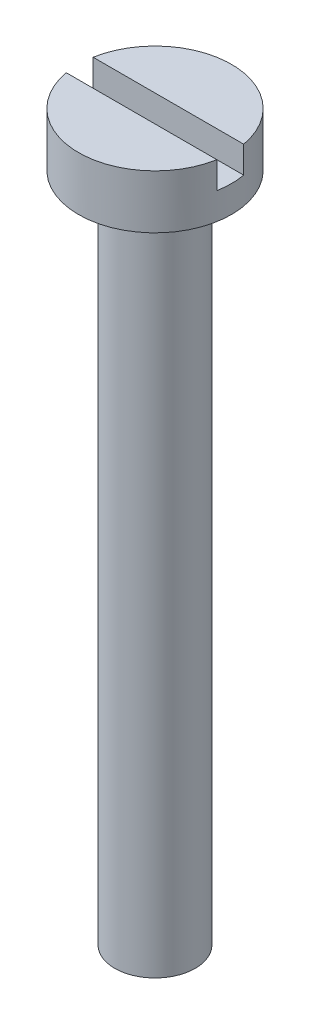
ISO-10303-21;
HEADER;
FILE_DESCRIPTION(('STEP AP214'),'2;1');
FILE_NAME('part.step','',(''),(''),'','','');
FILE_SCHEMA(('AUTOMOTIVE_DESIGN { 1 0 10303 214 1 1 1 1 }'));
ENDSEC;
DATA;
#1=APPLICATION_CONTEXT('core data for automotive mechanical design processes');
#2=APPLICATION_PROTOCOL_DEFINITION('international standard','automotive_design',2000,#1);
#3=PRODUCT_CONTEXT('',#1,'mechanical');
#4=PRODUCT('Part','Part','',(#3));
#5=PRODUCT_RELATED_PRODUCT_CATEGORY('part','',(#4));
#6=PRODUCT_DEFINITION_FORMATION('','',#4);
#7=PRODUCT_DEFINITION_CONTEXT('part definition',#1,'design');
#8=PRODUCT_DEFINITION('design','',#6,#7);
#9=PRODUCT_DEFINITION_SHAPE('','',#8);
#10=(LENGTH_UNIT() NAMED_UNIT(*) SI_UNIT(.MILLI.,.METRE.));
#11=(NAMED_UNIT(*) PLANE_ANGLE_UNIT() SI_UNIT($,.RADIAN.));
#12=(NAMED_UNIT(*) SI_UNIT($,.STERADIAN.) SOLID_ANGLE_UNIT());
#13=UNCERTAINTY_MEASURE_WITH_UNIT(LENGTH_MEASURE(1.E-05),#10,'distance_accuracy_value','');
#14=(GEOMETRIC_REPRESENTATION_CONTEXT(3) GLOBAL_UNCERTAINTY_ASSIGNED_CONTEXT((#13)) GLOBAL_UNIT_ASSIGNED_CONTEXT((#10,
#11,#12)) REPRESENTATION_CONTEXT('',''));
#15=CARTESIAN_POINT('',(0.,0.,0.));
#16=DIRECTION('',(0.,0.,1.));
#17=DIRECTION('',(1.,0.,0.));
#18=AXIS2_PLACEMENT_3D('',#15,#16,#17);
#19=CARTESIAN_POINT('',(0.,2.,0.));
#20=DIRECTION('',(0.,1.,0.));
#21=DIRECTION('',(0.,0.,1.));
#22=AXIS2_PLACEMENT_3D('',#19,#20,#21);
#23=PLANE('',#22);
#24=DIRECTION('',(1.,0.,0.));
#25=VECTOR('',#24,1.);
#26=CARTESIAN_POINT('',(0.,2.,0.5));
#27=LINE('',#26,#25);
#28=CARTESIAN_POINT('',(-2.80579756931964,2.,0.5));
#29=VERTEX_POINT('',#28);
#30=CARTESIAN_POINT('',(2.80579756931964,2.,0.5));
#31=VERTEX_POINT('',#30);
#32=EDGE_CURVE('E81',#29,#31,#27,.T.);
#33=ORIENTED_EDGE('',*,*,#32,.F.);
#34=CARTESIAN_POINT('',(0.,2.,0.));
#35=DIRECTION('',(0.,1.,0.));
#36=DIRECTION('',(0.,0.,1.));
#37=AXIS2_PLACEMENT_3D('',#34,#35,#36);
#38=CIRCLE('',#37,2.85);
#39=EDGE_CURVE('E91',#29,#31,#38,.T.);
#40=ORIENTED_EDGE('',*,*,#39,.T.);
#41=EDGE_LOOP('',(#33,#40));
#42=FACE_BOUND('',#41,.T.);
#43=ADVANCED_FACE('F33',(#42),#23,.T.);
#44=CARTESIAN_POINT('',(0.,2.,0.));
#45=DIRECTION('',(0.,-1.,0.));
#46=DIRECTION('',(0.,0.,-1.));
#47=AXIS2_PLACEMENT_3D('',#44,#45,#46);
#48=CYLINDRICAL_SURFACE('',#47,2.85);
#49=CARTESIAN_POINT('',(0.,1.,0.));
#50=DIRECTION('',(0.,-1.,0.));
#51=DIRECTION('',(0.,0.,-1.));
#52=AXIS2_PLACEMENT_3D('',#49,#50,#51);
#53=CIRCLE('',#52,2.85);
#54=CARTESIAN_POINT('',(2.80579756931964,1.,-0.5));
#55=VERTEX_POINT('',#54);
#56=CARTESIAN_POINT('',(2.80579756931964,1.,0.5));
#57=VERTEX_POINT('',#56);
#58=EDGE_CURVE('E11',#55,#57,#53,.T.);
#59=ORIENTED_EDGE('',*,*,#58,.T.);
#60=DIRECTION('',(0.,-1.,0.));
#61=VECTOR('',#60,1.);
#62=CARTESIAN_POINT('',(2.80579756931964,2.,0.5));
#63=LINE('',#62,#61);
#64=EDGE_CURVE('E56',#57,#31,#63,.F.);
#65=ORIENTED_EDGE('',*,*,#64,.T.);
#66=ORIENTED_EDGE('',*,*,#39,.F.);
#67=DIRECTION('',(0.,-1.,0.));
#68=VECTOR('',#67,1.);
#69=CARTESIAN_POINT('',(-2.80579756931964,2.,0.5));
#70=LINE('',#69,#68);
#71=CARTESIAN_POINT('',(-2.80579756931964,1.,0.5));
#72=VERTEX_POINT('',#71);
#73=EDGE_CURVE('E103',#29,#72,#70,.T.);
#74=ORIENTED_EDGE('',*,*,#73,.T.);
#75=CARTESIAN_POINT('',(-2.80579756931964,1.,-0.5));
#76=VERTEX_POINT('',#75);
#77=EDGE_CURVE('E37',#72,#76,#53,.T.);
#78=ORIENTED_EDGE('',*,*,#77,.T.);
#79=DIRECTION('',(0.,-1.,0.));
#80=VECTOR('',#79,1.);
#81=CARTESIAN_POINT('',(-2.80579756931964,2.,-0.5));
#82=LINE('',#81,#80);
#83=CARTESIAN_POINT('',(-2.80579756931964,2.,-0.5));
#84=VERTEX_POINT('',#83);
#85=EDGE_CURVE('E76',#76,#84,#82,.F.);
#86=ORIENTED_EDGE('',*,*,#85,.T.);
#87=CARTESIAN_POINT('',(2.80579756931964,2.,-0.5));
#88=VERTEX_POINT('',#87);
#89=EDGE_CURVE('E82',#88,#84,#38,.T.);
#90=ORIENTED_EDGE('',*,*,#89,.F.);
#91=DIRECTION('',(0.,-1.,0.));
#92=VECTOR('',#91,1.);
#93=CARTESIAN_POINT('',(2.80579756931964,2.,-0.5));
#94=LINE('',#93,#92);
#95=EDGE_CURVE('E48',#88,#55,#94,.T.);
#96=ORIENTED_EDGE('',*,*,#95,.T.);
#97=EDGE_LOOP('',(#59,#65,#66,#74,#78,#86,#90,#96));
#98=FACE_BOUND('',#97,.T.);
#99=CARTESIAN_POINT('',(0.,0.,0.));
#100=DIRECTION('',(0.,1.,0.));
#101=DIRECTION('',(0.,0.,1.));
#102=AXIS2_PLACEMENT_3D('',#99,#100,#101);
#103=CIRCLE('',#102,2.85);
#104=CARTESIAN_POINT('',(0.,0.,2.85));
#105=VERTEX_POINT('',#104);
#106=EDGE_CURVE('E94',#105,#105,#103,.T.);
#107=ORIENTED_EDGE('',*,*,#106,.T.);
#108=EDGE_LOOP('',(#107));
#109=FACE_BOUND('',#108,.T.);
#110=ADVANCED_FACE('F35',(#98,#109),#48,.T.);
#111=DIRECTION('',(-1.,0.,0.));
#112=VECTOR('',#111,1.);
#113=CARTESIAN_POINT('',(0.,2.,-0.5));
#114=LINE('',#113,#112);
#115=EDGE_CURVE('E73',#88,#84,#114,.T.);
#116=ORIENTED_EDGE('',*,*,#115,.F.);
#117=ORIENTED_EDGE('',*,*,#89,.T.);
#118=EDGE_LOOP('',(#116,#117));
#119=FACE_BOUND('',#118,.T.);
#120=ADVANCED_FACE('F90',(#119),#23,.T.);
#121=CARTESIAN_POINT('',(0.,0.,0.));
#122=DIRECTION('',(0.,1.,0.));
#123=DIRECTION('',(0.,0.,1.));
#124=AXIS2_PLACEMENT_3D('',#121,#122,#123);
#125=PLANE('',#124);
#126=CARTESIAN_POINT('',(0.,0.,0.));
#127=DIRECTION('',(0.,1.,0.));
#128=DIRECTION('',(0.,0.,1.));
#129=AXIS2_PLACEMENT_3D('',#126,#127,#128);
#130=CIRCLE('',#129,1.5);
#131=CARTESIAN_POINT('',(0.,0.,1.5));
#132=VERTEX_POINT('',#131);
#133=EDGE_CURVE('E97',#132,#132,#130,.T.);
#134=ORIENTED_EDGE('',*,*,#133,.T.);
#135=EDGE_LOOP('',(#134));
#136=FACE_BOUND('',#135,.T.);
#137=ORIENTED_EDGE('',*,*,#106,.F.);
#138=EDGE_LOOP('',(#137));
#139=FACE_BOUND('',#138,.T.);
#140=ADVANCED_FACE('F114',(#136,#139),#125,.F.);
#141=CARTESIAN_POINT('',(0.,-25.,0.));
#142=DIRECTION('',(0.,1.,0.));
#143=DIRECTION('',(0.,0.,1.));
#144=AXIS2_PLACEMENT_3D('',#141,#142,#143);
#145=CYLINDRICAL_SURFACE('',#144,1.5);
#146=CARTESIAN_POINT('',(0.,-25.,0.));
#147=DIRECTION('',(0.,1.,0.));
#148=DIRECTION('',(0.,0.,1.));
#149=AXIS2_PLACEMENT_3D('',#146,#147,#148);
#150=CIRCLE('',#149,1.5);
#151=CARTESIAN_POINT('',(0.,-25.,1.5));
#152=VERTEX_POINT('',#151);
#153=EDGE_CURVE('E100',#152,#152,#150,.T.);
#154=ORIENTED_EDGE('',*,*,#153,.T.);
#155=EDGE_LOOP('',(#154));
#156=FACE_BOUND('',#155,.T.);
#157=ORIENTED_EDGE('',*,*,#133,.F.);
#158=EDGE_LOOP('',(#157));
#159=FACE_BOUND('',#158,.T.);
#160=ADVANCED_FACE('F118',(#156,#159),#145,.T.);
#161=CARTESIAN_POINT('',(0.,-25.,0.));
#162=DIRECTION('',(0.,1.,0.));
#163=DIRECTION('',(0.,0.,1.));
#164=AXIS2_PLACEMENT_3D('',#161,#162,#163);
#165=PLANE('',#164);
#166=ORIENTED_EDGE('',*,*,#153,.F.);
#167=EDGE_LOOP('',(#166));
#168=FACE_BOUND('',#167,.T.);
#169=ADVANCED_FACE('F123',(#168),#165,.F.);
#170=CARTESIAN_POINT('',(0.,1.,0.));
#171=DIRECTION('',(0.,-1.,0.));
#172=DIRECTION('',(0.,0.,-1.));
#173=AXIS2_PLACEMENT_3D('',#170,#171,#172);
#174=PLANE('',#173);
#175=DIRECTION('',(-1.,0.,0.));
#176=VECTOR('',#175,1.);
#177=CARTESIAN_POINT('',(-3.,1.,-0.5));
#178=LINE('',#177,#176);
#179=EDGE_CURVE('E135',#55,#76,#178,.T.);
#180=ORIENTED_EDGE('',*,*,#179,.T.);
#181=ORIENTED_EDGE('',*,*,#77,.F.);
#182=DIRECTION('',(1.,0.,0.));
#183=VECTOR('',#182,1.);
#184=CARTESIAN_POINT('',(-3.,1.,0.5));
#185=LINE('',#184,#183);
#186=EDGE_CURVE('E88',#72,#57,#185,.T.);
#187=ORIENTED_EDGE('',*,*,#186,.T.);
#188=ORIENTED_EDGE('',*,*,#58,.F.);
#189=EDGE_LOOP('',(#180,#181,#187,#188));
#190=FACE_BOUND('',#189,.T.);
#191=ADVANCED_FACE('F137',(#190),#174,.F.);
#192=CARTESIAN_POINT('',(-3.,1.,0.5));
#193=DIRECTION('',(0.,0.,1.));
#194=DIRECTION('',(1.,0.,0.));
#195=AXIS2_PLACEMENT_3D('',#192,#193,#194);
#196=PLANE('',#195);
#197=ORIENTED_EDGE('',*,*,#32,.T.);
#198=ORIENTED_EDGE('',*,*,#64,.F.);
#199=ORIENTED_EDGE('',*,*,#186,.F.);
#200=ORIENTED_EDGE('',*,*,#73,.F.);
#201=EDGE_LOOP('',(#197,#198,#199,#200));
#202=FACE_BOUND('',#201,.T.);
#203=ADVANCED_FACE('F102',(#202),#196,.F.);
#204=CARTESIAN_POINT('',(-3.,1.,-0.5));
#205=DIRECTION('',(0.,0.,-1.));
#206=DIRECTION('',(-1.,0.,0.));
#207=AXIS2_PLACEMENT_3D('',#204,#205,#206);
#208=PLANE('',#207);
#209=ORIENTED_EDGE('',*,*,#115,.T.);
#210=ORIENTED_EDGE('',*,*,#85,.F.);
#211=ORIENTED_EDGE('',*,*,#179,.F.);
#212=ORIENTED_EDGE('',*,*,#95,.F.);
#213=EDGE_LOOP('',(#209,#210,#211,#212));
#214=FACE_BOUND('',#213,.T.);
#215=ADVANCED_FACE('F75',(#214),#208,.F.);
#216=CLOSED_SHELL('',(#43,#110,#120,#140,#160,#169,#191,#203,#215));
#217=MANIFOLD_SOLID_BREP('B2',#216);
#218=ADVANCED_BREP_SHAPE_REPRESENTATION('',(#18,#217),#14);
#219=SHAPE_DEFINITION_REPRESENTATION(#9,#218);
ENDSEC;
END-ISO-10303-21;
